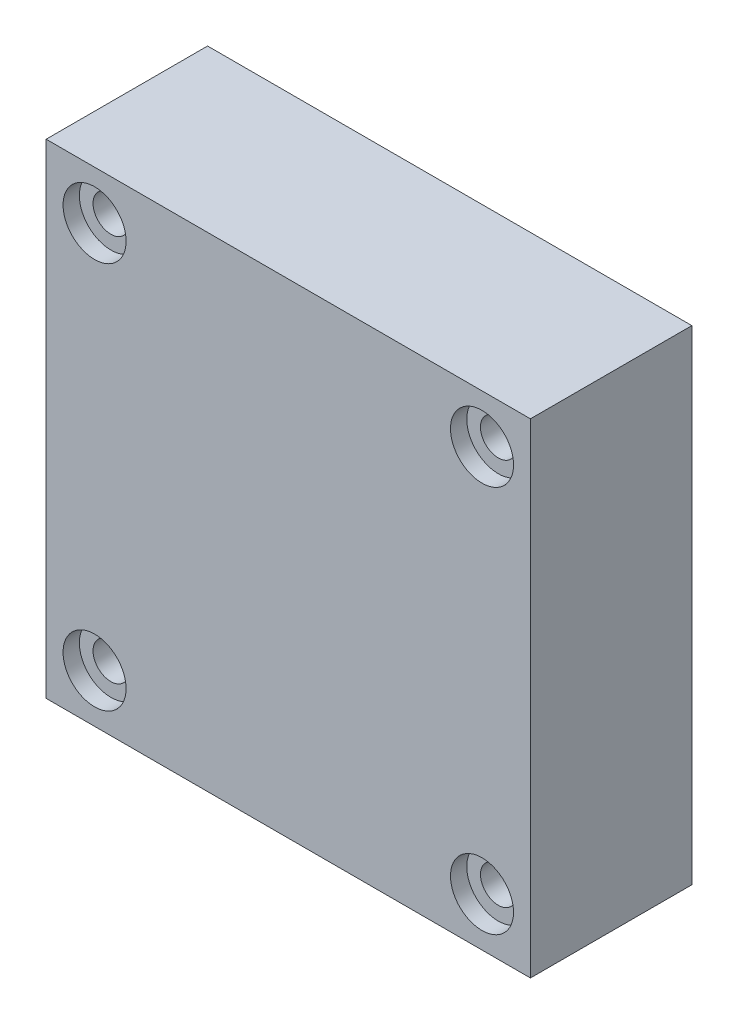
ISO-10303-21;
HEADER;
FILE_DESCRIPTION(('STEP AP214'),'2;1');
FILE_NAME('part.step','',(''),(''),'','','');
FILE_SCHEMA(('AUTOMOTIVE_DESIGN { 1 0 10303 214 1 1 1 1 }'));
ENDSEC;
DATA;
#1=APPLICATION_CONTEXT('core data for automotive mechanical design processes');
#2=APPLICATION_PROTOCOL_DEFINITION('international standard','automotive_design',2000,#1);
#3=PRODUCT_CONTEXT('',#1,'mechanical');
#4=PRODUCT('Part','Part','',(#3));
#5=PRODUCT_RELATED_PRODUCT_CATEGORY('part','',(#4));
#6=PRODUCT_DEFINITION_FORMATION('','',#4);
#7=PRODUCT_DEFINITION_CONTEXT('part definition',#1,'design');
#8=PRODUCT_DEFINITION('design','',#6,#7);
#9=PRODUCT_DEFINITION_SHAPE('','',#8);
#10=(LENGTH_UNIT() NAMED_UNIT(*) SI_UNIT(.MILLI.,.METRE.));
#11=(NAMED_UNIT(*) PLANE_ANGLE_UNIT() SI_UNIT($,.RADIAN.));
#12=(NAMED_UNIT(*) SI_UNIT($,.STERADIAN.) SOLID_ANGLE_UNIT());
#13=UNCERTAINTY_MEASURE_WITH_UNIT(LENGTH_MEASURE(1.E-05),#10,'distance_accuracy_value','');
#14=(GEOMETRIC_REPRESENTATION_CONTEXT(3) GLOBAL_UNCERTAINTY_ASSIGNED_CONTEXT((#13)) GLOBAL_UNIT_ASSIGNED_CONTEXT((#10,
#11,#12)) REPRESENTATION_CONTEXT('',''));
#15=CARTESIAN_POINT('',(0.,0.,0.));
#16=DIRECTION('',(0.,0.,1.));
#17=DIRECTION('',(1.,0.,0.));
#18=AXIS2_PLACEMENT_3D('',#15,#16,#17);
#19=CARTESIAN_POINT('',(0.,0.,25.4));
#20=DIRECTION('',(1.,0.,0.));
#21=DIRECTION('',(0.,0.,-1.));
#22=AXIS2_PLACEMENT_3D('',#19,#20,#21);
#23=PLANE('',#22);
#24=DIRECTION('',(0.,-1.,0.));
#25=VECTOR('',#24,1.);
#26=CARTESIAN_POINT('',(0.,0.,0.));
#27=LINE('',#26,#25);
#28=CARTESIAN_POINT('',(0.,76.2,0.));
#29=VERTEX_POINT('',#28);
#30=CARTESIAN_POINT('',(0.,0.,0.));
#31=VERTEX_POINT('',#30);
#32=EDGE_CURVE('E102',#29,#31,#27,.T.);
#33=ORIENTED_EDGE('',*,*,#32,.T.);
#34=DIRECTION('',(0.,0.,-1.));
#35=VECTOR('',#34,1.);
#36=CARTESIAN_POINT('',(0.,0.,25.4));
#37=LINE('',#36,#35);
#38=CARTESIAN_POINT('',(0.,0.,25.4));
#39=VERTEX_POINT('',#38);
#40=EDGE_CURVE('E11',#39,#31,#37,.T.);
#41=ORIENTED_EDGE('',*,*,#40,.F.);
#42=DIRECTION('',(0.,-1.,0.));
#43=VECTOR('',#42,1.);
#44=CARTESIAN_POINT('',(0.,0.,25.4));
#45=LINE('',#44,#43);
#46=CARTESIAN_POINT('',(0.,76.2,25.4));
#47=VERTEX_POINT('',#46);
#48=EDGE_CURVE('E90',#47,#39,#45,.T.);
#49=ORIENTED_EDGE('',*,*,#48,.F.);
#50=DIRECTION('',(0.,0.,-1.));
#51=VECTOR('',#50,1.);
#52=CARTESIAN_POINT('',(0.,76.2,25.4));
#53=LINE('',#52,#51);
#54=EDGE_CURVE('E98',#47,#29,#53,.T.);
#55=ORIENTED_EDGE('',*,*,#54,.T.);
#56=EDGE_LOOP('',(#33,#41,#49,#55));
#57=FACE_BOUND('',#56,.T.);
#58=ADVANCED_FACE('F39',(#57),#23,.F.);
#59=CARTESIAN_POINT('',(0.,0.,25.4));
#60=DIRECTION('',(0.,1.,0.));
#61=DIRECTION('',(0.,0.,1.));
#62=AXIS2_PLACEMENT_3D('',#59,#60,#61);
#63=PLANE('',#62);
#64=DIRECTION('',(1.,0.,0.));
#65=VECTOR('',#64,1.);
#66=CARTESIAN_POINT('',(0.,0.,0.));
#67=LINE('',#66,#65);
#68=CARTESIAN_POINT('',(76.2,0.,0.));
#69=VERTEX_POINT('',#68);
#70=EDGE_CURVE('E94',#31,#69,#67,.T.);
#71=ORIENTED_EDGE('',*,*,#70,.T.);
#72=DIRECTION('',(0.,0.,-1.));
#73=VECTOR('',#72,1.);
#74=CARTESIAN_POINT('',(76.2,0.,25.4));
#75=LINE('',#74,#73);
#76=CARTESIAN_POINT('',(76.2,0.,25.4));
#77=VERTEX_POINT('',#76);
#78=EDGE_CURVE('E47',#77,#69,#75,.T.);
#79=ORIENTED_EDGE('',*,*,#78,.F.);
#80=DIRECTION('',(1.,0.,0.));
#81=VECTOR('',#80,1.);
#82=CARTESIAN_POINT('',(0.,0.,25.4));
#83=LINE('',#82,#81);
#84=EDGE_CURVE('E85',#39,#77,#83,.T.);
#85=ORIENTED_EDGE('',*,*,#84,.F.);
#86=ORIENTED_EDGE('',*,*,#40,.T.);
#87=EDGE_LOOP('',(#71,#79,#85,#86));
#88=FACE_BOUND('',#87,.T.);
#89=ADVANCED_FACE('F93',(#88),#63,.F.);
#90=CARTESIAN_POINT('',(76.2,0.,25.4));
#91=DIRECTION('',(-1.,0.,0.));
#92=DIRECTION('',(0.,0.,1.));
#93=AXIS2_PLACEMENT_3D('',#90,#91,#92);
#94=PLANE('',#93);
#95=DIRECTION('',(0.,1.,0.));
#96=VECTOR('',#95,1.);
#97=CARTESIAN_POINT('',(76.2,0.,0.));
#98=LINE('',#97,#96);
#99=CARTESIAN_POINT('',(76.2,76.2,0.));
#100=VERTEX_POINT('',#99);
#101=EDGE_CURVE('E72',#69,#100,#98,.T.);
#102=ORIENTED_EDGE('',*,*,#101,.T.);
#103=DIRECTION('',(0.,0.,-1.));
#104=VECTOR('',#103,1.);
#105=CARTESIAN_POINT('',(76.2,76.2,25.4));
#106=LINE('',#105,#104);
#107=CARTESIAN_POINT('',(76.2,76.2,25.4));
#108=VERTEX_POINT('',#107);
#109=EDGE_CURVE('E95',#108,#100,#106,.T.);
#110=ORIENTED_EDGE('',*,*,#109,.F.);
#111=DIRECTION('',(0.,1.,0.));
#112=VECTOR('',#111,1.);
#113=CARTESIAN_POINT('',(76.2,0.,25.4));
#114=LINE('',#113,#112);
#115=EDGE_CURVE('E88',#77,#108,#114,.T.);
#116=ORIENTED_EDGE('',*,*,#115,.F.);
#117=ORIENTED_EDGE('',*,*,#78,.T.);
#118=EDGE_LOOP('',(#102,#110,#116,#117));
#119=FACE_BOUND('',#118,.T.);
#120=ADVANCED_FACE('F96',(#119),#94,.F.);
#121=CARTESIAN_POINT('',(0.,76.2,25.4));
#122=DIRECTION('',(0.,-1.,0.));
#123=DIRECTION('',(0.,0.,-1.));
#124=AXIS2_PLACEMENT_3D('',#121,#122,#123);
#125=PLANE('',#124);
#126=DIRECTION('',(-1.,0.,0.));
#127=VECTOR('',#126,1.);
#128=CARTESIAN_POINT('',(0.,76.2,0.));
#129=LINE('',#128,#127);
#130=EDGE_CURVE('E78',#100,#29,#129,.T.);
#131=ORIENTED_EDGE('',*,*,#130,.T.);
#132=ORIENTED_EDGE('',*,*,#54,.F.);
#133=DIRECTION('',(-1.,0.,0.));
#134=VECTOR('',#133,1.);
#135=CARTESIAN_POINT('',(0.,76.2,25.4));
#136=LINE('',#135,#134);
#137=EDGE_CURVE('E55',#108,#47,#136,.T.);
#138=ORIENTED_EDGE('',*,*,#137,.F.);
#139=ORIENTED_EDGE('',*,*,#109,.T.);
#140=EDGE_LOOP('',(#131,#132,#138,#139));
#141=FACE_BOUND('',#140,.T.);
#142=ADVANCED_FACE('F110',(#141),#125,.F.);
#143=CARTESIAN_POINT('',(0.,0.,25.4));
#144=DIRECTION('',(0.,0.,-1.));
#145=DIRECTION('',(-1.,0.,0.));
#146=AXIS2_PLACEMENT_3D('',#143,#144,#145);
#147=PLANE('',#146);
#148=CARTESIAN_POINT('',(7.62,68.58,25.4));
#149=DIRECTION('',(0.,0.,1.));
#150=DIRECTION('',(1.,0.,0.));
#151=AXIS2_PLACEMENT_3D('',#148,#149,#150);
#152=CIRCLE('',#151,4.96062);
#153=CARTESIAN_POINT('',(12.58062,68.58,25.4));
#154=VERTEX_POINT('',#153);
#155=EDGE_CURVE('E160',#154,#154,#152,.T.);
#156=ORIENTED_EDGE('',*,*,#155,.F.);
#157=EDGE_LOOP('',(#156));
#158=FACE_BOUND('',#157,.T.);
#159=CARTESIAN_POINT('',(68.58,68.58,25.4));
#160=DIRECTION('',(0.,0.,1.));
#161=DIRECTION('',(1.,0.,0.));
#162=AXIS2_PLACEMENT_3D('',#159,#160,#161);
#163=CIRCLE('',#162,4.96062);
#164=CARTESIAN_POINT('',(73.54062,68.58,25.4));
#165=VERTEX_POINT('',#164);
#166=EDGE_CURVE('E148',#165,#165,#163,.T.);
#167=ORIENTED_EDGE('',*,*,#166,.F.);
#168=EDGE_LOOP('',(#167));
#169=FACE_BOUND('',#168,.T.);
#170=CARTESIAN_POINT('',(68.58,7.62,25.4));
#171=DIRECTION('',(0.,0.,1.));
#172=DIRECTION('',(1.,0.,0.));
#173=AXIS2_PLACEMENT_3D('',#170,#171,#172);
#174=CIRCLE('',#173,4.96062);
#175=CARTESIAN_POINT('',(73.54062,7.62,25.4));
#176=VERTEX_POINT('',#175);
#177=EDGE_CURVE('E136',#176,#176,#174,.T.);
#178=ORIENTED_EDGE('',*,*,#177,.F.);
#179=EDGE_LOOP('',(#178));
#180=FACE_BOUND('',#179,.T.);
#181=CARTESIAN_POINT('',(7.62,7.62,25.4));
#182=DIRECTION('',(0.,0.,1.));
#183=DIRECTION('',(1.,0.,0.));
#184=AXIS2_PLACEMENT_3D('',#181,#182,#183);
#185=CIRCLE('',#184,4.96062);
#186=CARTESIAN_POINT('',(12.58062,7.62,25.4));
#187=VERTEX_POINT('',#186);
#188=EDGE_CURVE('E124',#187,#187,#185,.T.);
#189=ORIENTED_EDGE('',*,*,#188,.F.);
#190=EDGE_LOOP('',(#189));
#191=FACE_BOUND('',#190,.T.);
#192=ORIENTED_EDGE('',*,*,#48,.T.);
#193=ORIENTED_EDGE('',*,*,#84,.T.);
#194=ORIENTED_EDGE('',*,*,#115,.T.);
#195=ORIENTED_EDGE('',*,*,#137,.T.);
#196=EDGE_LOOP('',(#192,#193,#194,#195));
#197=FACE_BOUND('',#196,.T.);
#198=ADVANCED_FACE('F86',(#158,#169,#180,#191,#197),#147,.F.);
#199=CARTESIAN_POINT('',(0.,0.,0.));
#200=DIRECTION('',(0.,0.,-1.));
#201=DIRECTION('',(-1.,0.,0.));
#202=AXIS2_PLACEMENT_3D('',#199,#200,#201);
#203=PLANE('',#202);
#204=CARTESIAN_POINT('',(7.62,68.58,0.));
#205=DIRECTION('',(0.,0.,1.));
#206=DIRECTION('',(1.,0.,0.));
#207=AXIS2_PLACEMENT_3D('',#204,#205,#206);
#208=CIRCLE('',#207,2.80669999999999);
#209=CARTESIAN_POINT('',(10.4267,68.58,0.));
#210=VERTEX_POINT('',#209);
#211=EDGE_CURVE('E151',#210,#210,#208,.T.);
#212=ORIENTED_EDGE('',*,*,#211,.T.);
#213=EDGE_LOOP('',(#212));
#214=FACE_BOUND('',#213,.T.);
#215=CARTESIAN_POINT('',(68.58,68.58,0.));
#216=DIRECTION('',(0.,0.,1.));
#217=DIRECTION('',(1.,0.,0.));
#218=AXIS2_PLACEMENT_3D('',#215,#216,#217);
#219=CIRCLE('',#218,2.8067);
#220=CARTESIAN_POINT('',(71.3867,68.58,0.));
#221=VERTEX_POINT('',#220);
#222=EDGE_CURVE('E139',#221,#221,#219,.T.);
#223=ORIENTED_EDGE('',*,*,#222,.T.);
#224=EDGE_LOOP('',(#223));
#225=FACE_BOUND('',#224,.T.);
#226=CARTESIAN_POINT('',(68.58,7.62,0.));
#227=DIRECTION('',(0.,0.,1.));
#228=DIRECTION('',(1.,0.,0.));
#229=AXIS2_PLACEMENT_3D('',#226,#227,#228);
#230=CIRCLE('',#229,2.8067);
#231=CARTESIAN_POINT('',(71.3867,7.62,0.));
#232=VERTEX_POINT('',#231);
#233=EDGE_CURVE('E127',#232,#232,#230,.T.);
#234=ORIENTED_EDGE('',*,*,#233,.T.);
#235=EDGE_LOOP('',(#234));
#236=FACE_BOUND('',#235,.T.);
#237=CARTESIAN_POINT('',(7.62,7.62,0.));
#238=DIRECTION('',(0.,0.,1.));
#239=DIRECTION('',(1.,0.,0.));
#240=AXIS2_PLACEMENT_3D('',#237,#238,#239);
#241=CIRCLE('',#240,2.80669999999999);
#242=CARTESIAN_POINT('',(10.4267,7.62,0.));
#243=VERTEX_POINT('',#242);
#244=EDGE_CURVE('E105',#243,#243,#241,.T.);
#245=ORIENTED_EDGE('',*,*,#244,.T.);
#246=EDGE_LOOP('',(#245));
#247=FACE_BOUND('',#246,.T.);
#248=ORIENTED_EDGE('',*,*,#32,.F.);
#249=ORIENTED_EDGE('',*,*,#130,.F.);
#250=ORIENTED_EDGE('',*,*,#101,.F.);
#251=ORIENTED_EDGE('',*,*,#70,.F.);
#252=EDGE_LOOP('',(#248,#249,#250,#251));
#253=FACE_BOUND('',#252,.T.);
#254=ADVANCED_FACE('F113',(#214,#225,#236,#247,#253),#203,.T.);
#255=CARTESIAN_POINT('',(7.62,7.62,25.4));
#256=DIRECTION('',(0.,0.,1.));
#257=DIRECTION('',(1.,0.,0.));
#258=AXIS2_PLACEMENT_3D('',#255,#256,#257);
#259=CYLINDRICAL_SURFACE('',#258,2.8067);
#260=ORIENTED_EDGE('',*,*,#244,.F.);
#261=EDGE_LOOP('',(#260));
#262=FACE_BOUND('',#261,.T.);
#263=CARTESIAN_POINT('',(7.62,7.62,22.8346));
#264=DIRECTION('',(0.,0.,1.));
#265=DIRECTION('',(1.,0.,0.));
#266=AXIS2_PLACEMENT_3D('',#263,#264,#265);
#267=CIRCLE('',#266,2.8067);
#268=CARTESIAN_POINT('',(10.4267,7.62,22.8346));
#269=VERTEX_POINT('',#268);
#270=EDGE_CURVE('E118',#269,#269,#267,.T.);
#271=ORIENTED_EDGE('',*,*,#270,.T.);
#272=EDGE_LOOP('',(#271));
#273=FACE_BOUND('',#272,.T.);
#274=ADVANCED_FACE('F188',(#262,#273),#259,.F.);
#275=CARTESIAN_POINT('',(10.4267,7.62,22.8346));
#276=DIRECTION('',(0.,0.,-1.));
#277=DIRECTION('',(-1.,0.,0.));
#278=AXIS2_PLACEMENT_3D('',#275,#276,#277);
#279=PLANE('',#278);
#280=ORIENTED_EDGE('',*,*,#270,.F.);
#281=EDGE_LOOP('',(#280));
#282=FACE_BOUND('',#281,.T.);
#283=CARTESIAN_POINT('',(7.62,7.62,22.8346));
#284=DIRECTION('',(0.,0.,1.));
#285=DIRECTION('',(1.,0.,0.));
#286=AXIS2_PLACEMENT_3D('',#283,#284,#285);
#287=CIRCLE('',#286,4.96062);
#288=CARTESIAN_POINT('',(12.58062,7.62,22.8346));
#289=VERTEX_POINT('',#288);
#290=EDGE_CURVE('E121',#289,#289,#287,.T.);
#291=ORIENTED_EDGE('',*,*,#290,.T.);
#292=EDGE_LOOP('',(#291));
#293=FACE_BOUND('',#292,.T.);
#294=ADVANCED_FACE('F178',(#282,#293),#279,.F.);
#295=CARTESIAN_POINT('',(7.62,7.62,25.4));
#296=DIRECTION('',(0.,0.,1.));
#297=DIRECTION('',(1.,0.,0.));
#298=AXIS2_PLACEMENT_3D('',#295,#296,#297);
#299=CYLINDRICAL_SURFACE('',#298,4.96062);
#300=ORIENTED_EDGE('',*,*,#290,.F.);
#301=EDGE_LOOP('',(#300));
#302=FACE_BOUND('',#301,.T.);
#303=ORIENTED_EDGE('',*,*,#188,.T.);
#304=EDGE_LOOP('',(#303));
#305=FACE_BOUND('',#304,.T.);
#306=ADVANCED_FACE('F175',(#302,#305),#299,.F.);
#307=CARTESIAN_POINT('',(68.58,7.62,25.4));
#308=DIRECTION('',(0.,0.,1.));
#309=DIRECTION('',(1.,0.,0.));
#310=AXIS2_PLACEMENT_3D('',#307,#308,#309);
#311=CYLINDRICAL_SURFACE('',#310,2.8067);
#312=ORIENTED_EDGE('',*,*,#233,.F.);
#313=EDGE_LOOP('',(#312));
#314=FACE_BOUND('',#313,.T.);
#315=CARTESIAN_POINT('',(68.58,7.62,22.8346));
#316=DIRECTION('',(0.,0.,1.));
#317=DIRECTION('',(1.,0.,0.));
#318=AXIS2_PLACEMENT_3D('',#315,#316,#317);
#319=CIRCLE('',#318,2.8067);
#320=CARTESIAN_POINT('',(71.3867,7.62,22.8346));
#321=VERTEX_POINT('',#320);
#322=EDGE_CURVE('E130',#321,#321,#319,.T.);
#323=ORIENTED_EDGE('',*,*,#322,.T.);
#324=EDGE_LOOP('',(#323));
#325=FACE_BOUND('',#324,.T.);
#326=ADVANCED_FACE('F177',(#314,#325),#311,.F.);
#327=CARTESIAN_POINT('',(71.3867,7.62,22.8346));
#328=DIRECTION('',(0.,0.,-1.));
#329=DIRECTION('',(-1.,0.,0.));
#330=AXIS2_PLACEMENT_3D('',#327,#328,#329);
#331=PLANE('',#330);
#332=ORIENTED_EDGE('',*,*,#322,.F.);
#333=EDGE_LOOP('',(#332));
#334=FACE_BOUND('',#333,.T.);
#335=CARTESIAN_POINT('',(68.58,7.62,22.8346));
#336=DIRECTION('',(0.,0.,1.));
#337=DIRECTION('',(1.,0.,0.));
#338=AXIS2_PLACEMENT_3D('',#335,#336,#337);
#339=CIRCLE('',#338,4.96062);
#340=CARTESIAN_POINT('',(73.54062,7.62,22.8346));
#341=VERTEX_POINT('',#340);
#342=EDGE_CURVE('E133',#341,#341,#339,.T.);
#343=ORIENTED_EDGE('',*,*,#342,.T.);
#344=EDGE_LOOP('',(#343));
#345=FACE_BOUND('',#344,.T.);
#346=ADVANCED_FACE('F185',(#334,#345),#331,.F.);
#347=CARTESIAN_POINT('',(68.58,7.62,25.4));
#348=DIRECTION('',(0.,0.,1.));
#349=DIRECTION('',(1.,0.,0.));
#350=AXIS2_PLACEMENT_3D('',#347,#348,#349);
#351=CYLINDRICAL_SURFACE('',#350,4.96062);
#352=ORIENTED_EDGE('',*,*,#342,.F.);
#353=EDGE_LOOP('',(#352));
#354=FACE_BOUND('',#353,.T.);
#355=ORIENTED_EDGE('',*,*,#177,.T.);
#356=EDGE_LOOP('',(#355));
#357=FACE_BOUND('',#356,.T.);
#358=ADVANCED_FACE('F242',(#354,#357),#351,.F.);
#359=CARTESIAN_POINT('',(68.58,68.58,25.4));
#360=DIRECTION('',(0.,0.,1.));
#361=DIRECTION('',(1.,0.,0.));
#362=AXIS2_PLACEMENT_3D('',#359,#360,#361);
#363=CYLINDRICAL_SURFACE('',#362,2.8067);
#364=ORIENTED_EDGE('',*,*,#222,.F.);
#365=EDGE_LOOP('',(#364));
#366=FACE_BOUND('',#365,.T.);
#367=CARTESIAN_POINT('',(68.58,68.58,22.8346));
#368=DIRECTION('',(0.,0.,1.));
#369=DIRECTION('',(1.,0.,0.));
#370=AXIS2_PLACEMENT_3D('',#367,#368,#369);
#371=CIRCLE('',#370,2.8067);
#372=CARTESIAN_POINT('',(71.3867,68.58,22.8346));
#373=VERTEX_POINT('',#372);
#374=EDGE_CURVE('E142',#373,#373,#371,.T.);
#375=ORIENTED_EDGE('',*,*,#374,.T.);
#376=EDGE_LOOP('',(#375));
#377=FACE_BOUND('',#376,.T.);
#378=ADVANCED_FACE('F252',(#366,#377),#363,.F.);
#379=CARTESIAN_POINT('',(71.3867,68.58,22.8346));
#380=DIRECTION('',(0.,0.,-1.));
#381=DIRECTION('',(-1.,0.,0.));
#382=AXIS2_PLACEMENT_3D('',#379,#380,#381);
#383=PLANE('',#382);
#384=ORIENTED_EDGE('',*,*,#374,.F.);
#385=EDGE_LOOP('',(#384));
#386=FACE_BOUND('',#385,.T.);
#387=CARTESIAN_POINT('',(68.58,68.58,22.8346));
#388=DIRECTION('',(0.,0.,1.));
#389=DIRECTION('',(1.,0.,0.));
#390=AXIS2_PLACEMENT_3D('',#387,#388,#389);
#391=CIRCLE('',#390,4.96062);
#392=CARTESIAN_POINT('',(73.54062,68.58,22.8346));
#393=VERTEX_POINT('',#392);
#394=EDGE_CURVE('E145',#393,#393,#391,.T.);
#395=ORIENTED_EDGE('',*,*,#394,.T.);
#396=EDGE_LOOP('',(#395));
#397=FACE_BOUND('',#396,.T.);
#398=ADVANCED_FACE('F262',(#386,#397),#383,.F.);
#399=CARTESIAN_POINT('',(68.58,68.58,25.4));
#400=DIRECTION('',(0.,0.,1.));
#401=DIRECTION('',(1.,0.,0.));
#402=AXIS2_PLACEMENT_3D('',#399,#400,#401);
#403=CYLINDRICAL_SURFACE('',#402,4.96062);
#404=ORIENTED_EDGE('',*,*,#394,.F.);
#405=EDGE_LOOP('',(#404));
#406=FACE_BOUND('',#405,.T.);
#407=ORIENTED_EDGE('',*,*,#166,.T.);
#408=EDGE_LOOP('',(#407));
#409=FACE_BOUND('',#408,.T.);
#410=ADVANCED_FACE('F272',(#406,#409),#403,.F.);
#411=CARTESIAN_POINT('',(7.62,68.58,25.4));
#412=DIRECTION('',(0.,0.,1.));
#413=DIRECTION('',(1.,0.,0.));
#414=AXIS2_PLACEMENT_3D('',#411,#412,#413);
#415=CYLINDRICAL_SURFACE('',#414,2.8067);
#416=ORIENTED_EDGE('',*,*,#211,.F.);
#417=EDGE_LOOP('',(#416));
#418=FACE_BOUND('',#417,.T.);
#419=CARTESIAN_POINT('',(7.62,68.58,22.8346));
#420=DIRECTION('',(0.,0.,1.));
#421=DIRECTION('',(1.,0.,0.));
#422=AXIS2_PLACEMENT_3D('',#419,#420,#421);
#423=CIRCLE('',#422,2.8067);
#424=CARTESIAN_POINT('',(10.4267,68.58,22.8346));
#425=VERTEX_POINT('',#424);
#426=EDGE_CURVE('E154',#425,#425,#423,.T.);
#427=ORIENTED_EDGE('',*,*,#426,.T.);
#428=EDGE_LOOP('',(#427));
#429=FACE_BOUND('',#428,.T.);
#430=ADVANCED_FACE('F282',(#418,#429),#415,.F.);
#431=CARTESIAN_POINT('',(10.4267,68.58,22.8346));
#432=DIRECTION('',(0.,0.,-1.));
#433=DIRECTION('',(-1.,0.,0.));
#434=AXIS2_PLACEMENT_3D('',#431,#432,#433);
#435=PLANE('',#434);
#436=ORIENTED_EDGE('',*,*,#426,.F.);
#437=EDGE_LOOP('',(#436));
#438=FACE_BOUND('',#437,.T.);
#439=CARTESIAN_POINT('',(7.62,68.58,22.8346));
#440=DIRECTION('',(0.,0.,1.));
#441=DIRECTION('',(1.,0.,0.));
#442=AXIS2_PLACEMENT_3D('',#439,#440,#441);
#443=CIRCLE('',#442,4.96062);
#444=CARTESIAN_POINT('',(12.58062,68.58,22.8346));
#445=VERTEX_POINT('',#444);
#446=EDGE_CURVE('E157',#445,#445,#443,.T.);
#447=ORIENTED_EDGE('',*,*,#446,.T.);
#448=EDGE_LOOP('',(#447));
#449=FACE_BOUND('',#448,.T.);
#450=ADVANCED_FACE('F292',(#438,#449),#435,.F.);
#451=CARTESIAN_POINT('',(7.62,68.58,25.4));
#452=DIRECTION('',(0.,0.,1.));
#453=DIRECTION('',(1.,0.,0.));
#454=AXIS2_PLACEMENT_3D('',#451,#452,#453);
#455=CYLINDRICAL_SURFACE('',#454,4.96062);
#456=ORIENTED_EDGE('',*,*,#446,.F.);
#457=EDGE_LOOP('',(#456));
#458=FACE_BOUND('',#457,.T.);
#459=ORIENTED_EDGE('',*,*,#155,.T.);
#460=EDGE_LOOP('',(#459));
#461=FACE_BOUND('',#460,.T.);
#462=ADVANCED_FACE('F164',(#458,#461),#455,.F.);
#463=CLOSED_SHELL('',(#58,#89,#120,#142,#198,#254,#274,#294,#306,#326,#346,#358,#378,#398,#410,
#430,#450,#462));
#464=MANIFOLD_SOLID_BREP('B2',#463);
#465=ADVANCED_BREP_SHAPE_REPRESENTATION('',(#18,#464),#14);
#466=SHAPE_DEFINITION_REPRESENTATION(#9,#465);
ENDSEC;
END-ISO-10303-21;
